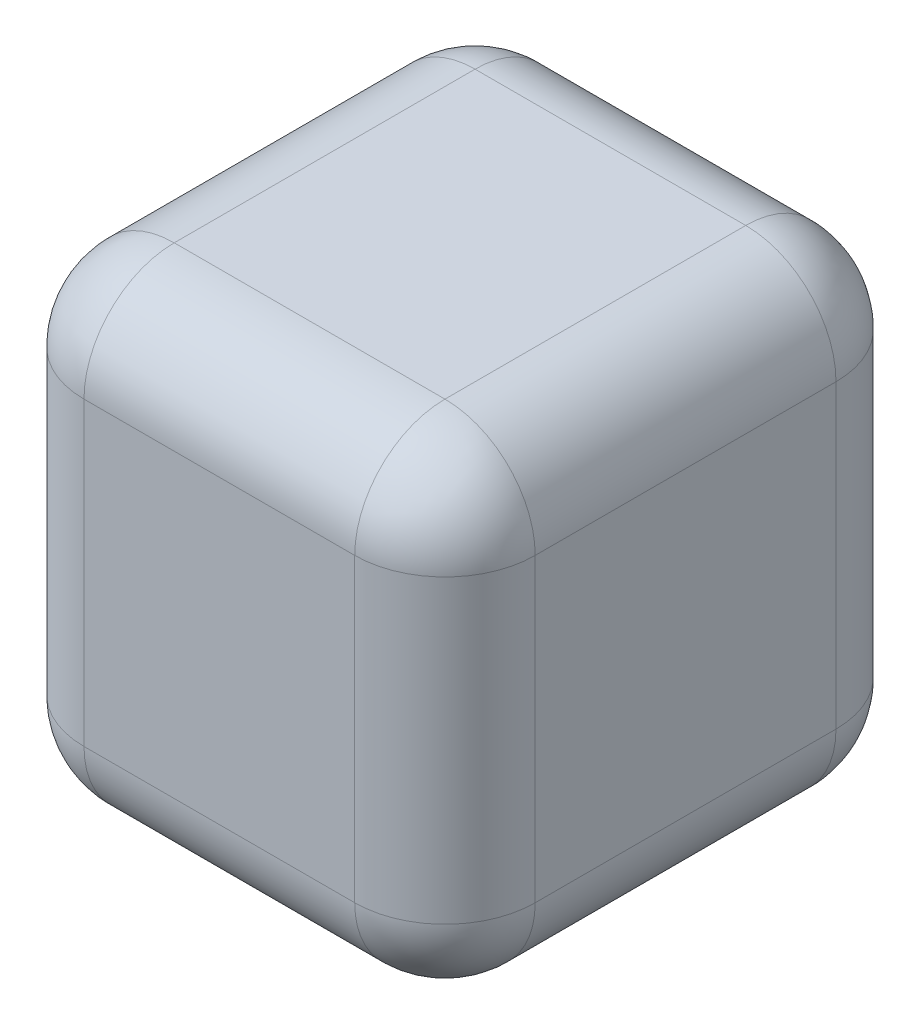
ISO-10303-21;
HEADER;
FILE_DESCRIPTION(('STEP AP214'),'2;1');
FILE_NAME('part.step','',(''),(''),'','','');
FILE_SCHEMA(('AUTOMOTIVE_DESIGN { 1 0 10303 214 1 1 1 1 }'));
ENDSEC;
DATA;
#1=APPLICATION_CONTEXT('core data for automotive mechanical design processes');
#2=APPLICATION_PROTOCOL_DEFINITION('international standard','automotive_design',2000,#1);
#3=PRODUCT_CONTEXT('',#1,'mechanical');
#4=PRODUCT('Part','Part','',(#3));
#5=PRODUCT_RELATED_PRODUCT_CATEGORY('part','',(#4));
#6=PRODUCT_DEFINITION_FORMATION('','',#4);
#7=PRODUCT_DEFINITION_CONTEXT('part definition',#1,'design');
#8=PRODUCT_DEFINITION('design','',#6,#7);
#9=PRODUCT_DEFINITION_SHAPE('','',#8);
#10=(LENGTH_UNIT() NAMED_UNIT(*) SI_UNIT(.MILLI.,.METRE.));
#11=(NAMED_UNIT(*) PLANE_ANGLE_UNIT() SI_UNIT($,.RADIAN.));
#12=(NAMED_UNIT(*) SI_UNIT($,.STERADIAN.) SOLID_ANGLE_UNIT());
#13=UNCERTAINTY_MEASURE_WITH_UNIT(LENGTH_MEASURE(1.E-05),#10,'distance_accuracy_value','');
#14=(GEOMETRIC_REPRESENTATION_CONTEXT(3) GLOBAL_UNCERTAINTY_ASSIGNED_CONTEXT((#13)) GLOBAL_UNIT_ASSIGNED_CONTEXT((#10,
#11,#12)) REPRESENTATION_CONTEXT('',''));
#15=CARTESIAN_POINT('',(0.,0.,0.));
#16=DIRECTION('',(0.,0.,1.));
#17=DIRECTION('',(1.,0.,0.));
#18=AXIS2_PLACEMENT_3D('',#15,#16,#17);
#19=CARTESIAN_POINT('',(54.,-16.,16.));
#20=DIRECTION('',(0.,0.,-1.));
#21=DIRECTION('',(-1.,0.,0.));
#22=AXIS2_PLACEMENT_3D('',#19,#20,#21);
#23=PLANE('',#22);
#24=DIRECTION('',(0.,-1.,0.));
#25=VECTOR('',#24,1.);
#26=CARTESIAN_POINT('',(48.,-16.,16.));
#27=LINE('',#26,#25);
#28=CARTESIAN_POINT('',(48.,-10.,16.));
#29=VERTEX_POINT('',#28);
#30=CARTESIAN_POINT('',(48.,10.,16.));
#31=VERTEX_POINT('',#30);
#32=EDGE_CURVE('E158',#29,#31,#27,.F.);
#33=ORIENTED_EDGE('',*,*,#32,.T.);
#34=DIRECTION('',(-1.,0.,0.));
#35=VECTOR('',#34,1.);
#36=CARTESIAN_POINT('',(54.,10.,16.));
#37=LINE('',#36,#35);
#38=CARTESIAN_POINT('',(30.,10.,16.));
#39=VERTEX_POINT('',#38);
#40=EDGE_CURVE('E161',#31,#39,#37,.T.);
#41=ORIENTED_EDGE('',*,*,#40,.T.);
#42=DIRECTION('',(0.,-1.,0.));
#43=VECTOR('',#42,1.);
#44=CARTESIAN_POINT('',(30.,-16.,16.));
#45=LINE('',#44,#43);
#46=CARTESIAN_POINT('',(30.,-10.,16.));
#47=VERTEX_POINT('',#46);
#48=EDGE_CURVE('E134',#39,#47,#45,.T.);
#49=ORIENTED_EDGE('',*,*,#48,.T.);
#50=DIRECTION('',(-1.,0.,0.));
#51=VECTOR('',#50,1.);
#52=CARTESIAN_POINT('',(54.,-10.,16.));
#53=LINE('',#52,#51);
#54=EDGE_CURVE('E153',#47,#29,#53,.F.);
#55=ORIENTED_EDGE('',*,*,#54,.T.);
#56=EDGE_LOOP('',(#33,#41,#49,#55));
#57=FACE_BOUND('',#56,.T.);
#58=ADVANCED_FACE('F37',(#57),#23,.F.);
#59=CARTESIAN_POINT('',(54.,-16.,16.));
#60=DIRECTION('',(0.,1.,0.));
#61=DIRECTION('',(0.,0.,1.));
#62=AXIS2_PLACEMENT_3D('',#59,#60,#61);
#63=PLANE('',#62);
#64=DIRECTION('',(0.,0.,-1.));
#65=VECTOR('',#64,1.);
#66=CARTESIAN_POINT('',(30.,-16.,-16.));
#67=LINE('',#66,#65);
#68=CARTESIAN_POINT('',(30.,-16.,10.));
#69=VERTEX_POINT('',#68);
#70=CARTESIAN_POINT('',(30.,-16.,-10.));
#71=VERTEX_POINT('',#70);
#72=EDGE_CURVE('E178',#69,#71,#67,.T.);
#73=ORIENTED_EDGE('',*,*,#72,.T.);
#74=DIRECTION('',(-1.,0.,0.));
#75=VECTOR('',#74,1.);
#76=CARTESIAN_POINT('',(54.,-16.,-10.));
#77=LINE('',#76,#75);
#78=CARTESIAN_POINT('',(48.,-16.,-10.));
#79=VERTEX_POINT('',#78);
#80=EDGE_CURVE('E181',#71,#79,#77,.F.);
#81=ORIENTED_EDGE('',*,*,#80,.T.);
#82=DIRECTION('',(0.,0.,-1.));
#83=VECTOR('',#82,1.);
#84=CARTESIAN_POINT('',(48.,-16.,16.));
#85=LINE('',#84,#83);
#86=CARTESIAN_POINT('',(48.,-16.,10.));
#87=VERTEX_POINT('',#86);
#88=EDGE_CURVE('E176',#79,#87,#85,.F.);
#89=ORIENTED_EDGE('',*,*,#88,.T.);
#90=DIRECTION('',(-1.,0.,0.));
#91=VECTOR('',#90,1.);
#92=CARTESIAN_POINT('',(54.,-16.,10.));
#93=LINE('',#92,#91);
#94=EDGE_CURVE('E174',#87,#69,#93,.T.);
#95=ORIENTED_EDGE('',*,*,#94,.T.);
#96=EDGE_LOOP('',(#73,#81,#89,#95));
#97=FACE_BOUND('',#96,.T.);
#98=ADVANCED_FACE('F328',(#97),#63,.F.);
#99=CARTESIAN_POINT('',(54.,-16.,-16.));
#100=DIRECTION('',(0.,0.,1.));
#101=DIRECTION('',(1.,0.,0.));
#102=AXIS2_PLACEMENT_3D('',#99,#100,#101);
#103=PLANE('',#102);
#104=DIRECTION('',(0.,1.,0.));
#105=VECTOR('',#104,1.);
#106=CARTESIAN_POINT('',(30.,16.,-16.));
#107=LINE('',#106,#105);
#108=CARTESIAN_POINT('',(30.,-10.,-16.));
#109=VERTEX_POINT('',#108);
#110=CARTESIAN_POINT('',(30.,10.,-16.));
#111=VERTEX_POINT('',#110);
#112=EDGE_CURVE('E187',#109,#111,#107,.T.);
#113=ORIENTED_EDGE('',*,*,#112,.T.);
#114=DIRECTION('',(-1.,0.,0.));
#115=VECTOR('',#114,1.);
#116=CARTESIAN_POINT('',(54.,10.,-16.));
#117=LINE('',#116,#115);
#118=CARTESIAN_POINT('',(48.,10.,-16.));
#119=VERTEX_POINT('',#118);
#120=EDGE_CURVE('E190',#111,#119,#117,.F.);
#121=ORIENTED_EDGE('',*,*,#120,.T.);
#122=DIRECTION('',(0.,1.,0.));
#123=VECTOR('',#122,1.);
#124=CARTESIAN_POINT('',(48.,-16.,-16.));
#125=LINE('',#124,#123);
#126=CARTESIAN_POINT('',(48.,-10.,-16.));
#127=VERTEX_POINT('',#126);
#128=EDGE_CURVE('E185',#119,#127,#125,.F.);
#129=ORIENTED_EDGE('',*,*,#128,.T.);
#130=DIRECTION('',(-1.,0.,0.));
#131=VECTOR('',#130,1.);
#132=CARTESIAN_POINT('',(54.,-10.,-16.));
#133=LINE('',#132,#131);
#134=EDGE_CURVE('E183',#127,#109,#133,.T.);
#135=ORIENTED_EDGE('',*,*,#134,.T.);
#136=EDGE_LOOP('',(#113,#121,#129,#135));
#137=FACE_BOUND('',#136,.T.);
#138=ADVANCED_FACE('F298',(#137),#103,.F.);
#139=CARTESIAN_POINT('',(54.,16.,16.));
#140=DIRECTION('',(0.,-1.,0.));
#141=DIRECTION('',(0.,0.,-1.));
#142=AXIS2_PLACEMENT_3D('',#139,#140,#141);
#143=PLANE('',#142);
#144=DIRECTION('',(0.,0.,1.));
#145=VECTOR('',#144,1.);
#146=CARTESIAN_POINT('',(30.,16.,16.));
#147=LINE('',#146,#145);
#148=CARTESIAN_POINT('',(30.,16.,-10.));
#149=VERTEX_POINT('',#148);
#150=CARTESIAN_POINT('',(30.,16.,10.));
#151=VERTEX_POINT('',#150);
#152=EDGE_CURVE('E196',#149,#151,#147,.T.);
#153=ORIENTED_EDGE('',*,*,#152,.T.);
#154=DIRECTION('',(-1.,0.,0.));
#155=VECTOR('',#154,1.);
#156=CARTESIAN_POINT('',(54.,16.,10.));
#157=LINE('',#156,#155);
#158=CARTESIAN_POINT('',(48.,16.,10.));
#159=VERTEX_POINT('',#158);
#160=EDGE_CURVE('E199',#151,#159,#157,.F.);
#161=ORIENTED_EDGE('',*,*,#160,.T.);
#162=DIRECTION('',(0.,0.,1.));
#163=VECTOR('',#162,1.);
#164=CARTESIAN_POINT('',(48.,16.,16.));
#165=LINE('',#164,#163);
#166=CARTESIAN_POINT('',(48.,16.,-10.));
#167=VERTEX_POINT('',#166);
#168=EDGE_CURVE('E194',#159,#167,#165,.F.);
#169=ORIENTED_EDGE('',*,*,#168,.T.);
#170=DIRECTION('',(-1.,0.,0.));
#171=VECTOR('',#170,1.);
#172=CARTESIAN_POINT('',(54.,16.,-10.));
#173=LINE('',#172,#171);
#174=EDGE_CURVE('E192',#167,#149,#173,.T.);
#175=ORIENTED_EDGE('',*,*,#174,.T.);
#176=EDGE_LOOP('',(#153,#161,#169,#175));
#177=FACE_BOUND('',#176,.T.);
#178=ADVANCED_FACE('F274',(#177),#143,.F.);
#179=CARTESIAN_POINT('',(54.,0.,0.));
#180=DIRECTION('',(-1.,0.,0.));
#181=DIRECTION('',(0.,0.,1.));
#182=AXIS2_PLACEMENT_3D('',#179,#180,#181);
#183=PLANE('',#182);
#184=DIRECTION('',(0.,0.,1.));
#185=VECTOR('',#184,1.);
#186=CARTESIAN_POINT('',(54.,10.,0.));
#187=LINE('',#186,#185);
#188=CARTESIAN_POINT('',(54.,10.,-10.));
#189=VERTEX_POINT('',#188);
#190=CARTESIAN_POINT('',(54.,10.,10.));
#191=VERTEX_POINT('',#190);
#192=EDGE_CURVE('E201',#189,#191,#187,.T.);
#193=ORIENTED_EDGE('',*,*,#192,.T.);
#194=DIRECTION('',(0.,-1.,0.));
#195=VECTOR('',#194,1.);
#196=CARTESIAN_POINT('',(54.,0.,10.));
#197=LINE('',#196,#195);
#198=CARTESIAN_POINT('',(54.,-10.,10.));
#199=VERTEX_POINT('',#198);
#200=EDGE_CURVE('E11',#191,#199,#197,.T.);
#201=ORIENTED_EDGE('',*,*,#200,.T.);
#202=DIRECTION('',(0.,0.,-1.));
#203=VECTOR('',#202,1.);
#204=CARTESIAN_POINT('',(54.,-10.,0.));
#205=LINE('',#204,#203);
#206=CARTESIAN_POINT('',(54.,-10.,-10.));
#207=VERTEX_POINT('',#206);
#208=EDGE_CURVE('E46',#199,#207,#205,.T.);
#209=ORIENTED_EDGE('',*,*,#208,.T.);
#210=DIRECTION('',(0.,1.,0.));
#211=VECTOR('',#210,1.);
#212=CARTESIAN_POINT('',(54.,0.,-10.));
#213=LINE('',#212,#211);
#214=EDGE_CURVE('E203',#207,#189,#213,.T.);
#215=ORIENTED_EDGE('',*,*,#214,.T.);
#216=EDGE_LOOP('',(#193,#201,#209,#215));
#217=FACE_BOUND('',#216,.T.);
#218=ADVANCED_FACE('F282',(#217),#183,.F.);
#219=CARTESIAN_POINT('',(24.,0.,0.));
#220=DIRECTION('',(-1.,0.,0.));
#221=DIRECTION('',(0.,0.,1.));
#222=AXIS2_PLACEMENT_3D('',#219,#220,#221);
#223=PLANE('',#222);
#224=CARTESIAN_POINT('',(24.,4.,-4.));
#225=DIRECTION('',(1.,0.,0.));
#226=DIRECTION('',(0.,0.,-1.));
#227=AXIS2_PLACEMENT_3D('',#224,#225,#226);
#228=CIRCLE('',#227,1.5);
#229=CARTESIAN_POINT('',(24.,4.,-5.5));
#230=VERTEX_POINT('',#229);
#231=EDGE_CURVE('E610',#230,#230,#228,.T.);
#232=ORIENTED_EDGE('',*,*,#231,.T.);
#233=EDGE_LOOP('',(#232));
#234=FACE_BOUND('',#233,.T.);
#235=CARTESIAN_POINT('',(24.,4.,4.));
#236=DIRECTION('',(1.,0.,0.));
#237=DIRECTION('',(0.,0.,-1.));
#238=AXIS2_PLACEMENT_3D('',#235,#236,#237);
#239=CIRCLE('',#238,1.5);
#240=CARTESIAN_POINT('',(24.,4.,2.5));
#241=VERTEX_POINT('',#240);
#242=EDGE_CURVE('E615',#241,#241,#239,.T.);
#243=ORIENTED_EDGE('',*,*,#242,.T.);
#244=EDGE_LOOP('',(#243));
#245=FACE_BOUND('',#244,.T.);
#246=CARTESIAN_POINT('',(24.,-4.,-4.));
#247=DIRECTION('',(1.,0.,0.));
#248=DIRECTION('',(0.,0.,-1.));
#249=AXIS2_PLACEMENT_3D('',#246,#247,#248);
#250=CIRCLE('',#249,1.5);
#251=CARTESIAN_POINT('',(24.,-4.,-5.5));
#252=VERTEX_POINT('',#251);
#253=EDGE_CURVE('E621',#252,#252,#250,.T.);
#254=ORIENTED_EDGE('',*,*,#253,.T.);
#255=EDGE_LOOP('',(#254));
#256=FACE_BOUND('',#255,.T.);
#257=CARTESIAN_POINT('',(24.,-4.,4.));
#258=DIRECTION('',(1.,0.,0.));
#259=DIRECTION('',(0.,0.,-1.));
#260=AXIS2_PLACEMENT_3D('',#257,#258,#259);
#261=CIRCLE('',#260,1.5);
#262=CARTESIAN_POINT('',(24.,-4.,2.5));
#263=VERTEX_POINT('',#262);
#264=EDGE_CURVE('E140',#263,#263,#261,.T.);
#265=ORIENTED_EDGE('',*,*,#264,.T.);
#266=EDGE_LOOP('',(#265));
#267=FACE_BOUND('',#266,.T.);
#268=DIRECTION('',(0.,0.,-1.));
#269=VECTOR('',#268,1.);
#270=CARTESIAN_POINT('',(24.,-10.,16.));
#271=LINE('',#270,#269);
#272=CARTESIAN_POINT('',(24.,-10.,-10.));
#273=VERTEX_POINT('',#272);
#274=CARTESIAN_POINT('',(24.,-10.,10.));
#275=VERTEX_POINT('',#274);
#276=EDGE_CURVE('E171',#273,#275,#271,.F.);
#277=ORIENTED_EDGE('',*,*,#276,.T.);
#278=DIRECTION('',(0.,-1.,0.));
#279=VECTOR('',#278,1.);
#280=CARTESIAN_POINT('',(24.,16.,10.));
#281=LINE('',#280,#279);
#282=CARTESIAN_POINT('',(24.,10.,10.));
#283=VERTEX_POINT('',#282);
#284=EDGE_CURVE('E136',#275,#283,#281,.F.);
#285=ORIENTED_EDGE('',*,*,#284,.T.);
#286=DIRECTION('',(0.,0.,1.));
#287=VECTOR('',#286,1.);
#288=CARTESIAN_POINT('',(24.,10.,-16.));
#289=LINE('',#288,#287);
#290=CARTESIAN_POINT('',(24.,10.,-10.));
#291=VERTEX_POINT('',#290);
#292=EDGE_CURVE('E164',#283,#291,#289,.F.);
#293=ORIENTED_EDGE('',*,*,#292,.T.);
#294=DIRECTION('',(0.,1.,0.));
#295=VECTOR('',#294,1.);
#296=CARTESIAN_POINT('',(24.,-16.,-10.));
#297=LINE('',#296,#295);
#298=EDGE_CURVE('E169',#291,#273,#297,.F.);
#299=ORIENTED_EDGE('',*,*,#298,.T.);
#300=EDGE_LOOP('',(#277,#285,#293,#299));
#301=FACE_BOUND('',#300,.T.);
#302=ADVANCED_FACE('F362',(#234,#245,#256,#267,#301),#223,.T.);
#303=CARTESIAN_POINT('',(48.,0.,-10.));
#304=DIRECTION('',(0.,1.,0.));
#305=DIRECTION('',(0.,0.,1.));
#306=AXIS2_PLACEMENT_3D('',#303,#304,#305);
#307=CYLINDRICAL_SURFACE('',#306,6.);
#308=CARTESIAN_POINT('',(48.,10.,-10.));
#309=DIRECTION('',(0.,1.,0.));
#310=DIRECTION('',(0.,0.,1.));
#311=AXIS2_PLACEMENT_3D('',#308,#309,#310);
#312=CIRCLE('',#311,6.);
#313=EDGE_CURVE('E41',#189,#119,#312,.T.);
#314=ORIENTED_EDGE('',*,*,#313,.F.);
#315=ORIENTED_EDGE('',*,*,#214,.F.);
#316=CARTESIAN_POINT('',(48.,-10.,-10.));
#317=DIRECTION('',(0.,-1.,0.));
#318=DIRECTION('',(0.,0.,-1.));
#319=AXIS2_PLACEMENT_3D('',#316,#317,#318);
#320=CIRCLE('',#319,6.);
#321=EDGE_CURVE('E252',#127,#207,#320,.T.);
#322=ORIENTED_EDGE('',*,*,#321,.F.);
#323=ORIENTED_EDGE('',*,*,#128,.F.);
#324=EDGE_LOOP('',(#314,#315,#322,#323));
#325=FACE_BOUND('',#324,.T.);
#326=ADVANCED_FACE('F39',(#325),#307,.T.);
#327=CARTESIAN_POINT('',(48.,10.,-10.));
#328=DIRECTION('',(0.,0.,-1.));
#329=DIRECTION('',(-1.,0.,0.));
#330=AXIS2_PLACEMENT_3D('',#327,#328,#329);
#331=SPHERICAL_SURFACE('',#330,6.);
#332=CARTESIAN_POINT('',(48.,10.,-10.));
#333=DIRECTION('',(0.,0.,-1.));
#334=DIRECTION('',(-1.,0.,0.));
#335=AXIS2_PLACEMENT_3D('',#332,#333,#334);
#336=CIRCLE('',#335,6.);
#337=EDGE_CURVE('E247',#189,#167,#336,.F.);
#338=ORIENTED_EDGE('',*,*,#337,.F.);
#339=ORIENTED_EDGE('',*,*,#313,.T.);
#340=CARTESIAN_POINT('',(48.,10.,-10.));
#341=DIRECTION('',(1.,0.,0.));
#342=DIRECTION('',(0.,0.,-1.));
#343=AXIS2_PLACEMENT_3D('',#340,#341,#342);
#344=CIRCLE('',#343,6.);
#345=EDGE_CURVE('E250',#167,#119,#344,.F.);
#346=ORIENTED_EDGE('',*,*,#345,.F.);
#347=EDGE_LOOP('',(#338,#339,#346));
#348=FACE_BOUND('',#347,.T.);
#349=ADVANCED_FACE('F263',(#348),#331,.T.);
#350=CARTESIAN_POINT('',(48.,-10.,-10.));
#351=DIRECTION('',(1.,0.,0.));
#352=DIRECTION('',(0.,0.,-1.));
#353=AXIS2_PLACEMENT_3D('',#350,#351,#352);
#354=SPHERICAL_SURFACE('',#353,6.);
#355=CARTESIAN_POINT('',(48.,-10.,-10.));
#356=DIRECTION('',(1.,0.,0.));
#357=DIRECTION('',(0.,0.,-1.));
#358=AXIS2_PLACEMENT_3D('',#355,#356,#357);
#359=CIRCLE('',#358,6.);
#360=EDGE_CURVE('E241',#127,#79,#359,.F.);
#361=ORIENTED_EDGE('',*,*,#360,.F.);
#362=ORIENTED_EDGE('',*,*,#321,.T.);
#363=CARTESIAN_POINT('',(48.,-10.,-10.));
#364=DIRECTION('',(0.,0.,-1.));
#365=DIRECTION('',(-1.,0.,0.));
#366=AXIS2_PLACEMENT_3D('',#363,#364,#365);
#367=CIRCLE('',#366,6.);
#368=EDGE_CURVE('E244',#79,#207,#367,.F.);
#369=ORIENTED_EDGE('',*,*,#368,.F.);
#370=EDGE_LOOP('',(#361,#362,#369));
#371=FACE_BOUND('',#370,.T.);
#372=ADVANCED_FACE('F290',(#371),#354,.T.);
#373=CARTESIAN_POINT('',(54.,10.,-10.));
#374=DIRECTION('',(-1.,0.,0.));
#375=DIRECTION('',(0.,0.,1.));
#376=AXIS2_PLACEMENT_3D('',#373,#374,#375);
#377=CYLINDRICAL_SURFACE('',#376,6.);
#378=ORIENTED_EDGE('',*,*,#345,.T.);
#379=ORIENTED_EDGE('',*,*,#120,.F.);
#380=CARTESIAN_POINT('',(30.,10.,-10.));
#381=DIRECTION('',(-1.,0.,0.));
#382=DIRECTION('',(0.,0.,1.));
#383=AXIS2_PLACEMENT_3D('',#380,#381,#382);
#384=CIRCLE('',#383,6.);
#385=EDGE_CURVE('E236',#149,#111,#384,.T.);
#386=ORIENTED_EDGE('',*,*,#385,.F.);
#387=ORIENTED_EDGE('',*,*,#174,.F.);
#388=EDGE_LOOP('',(#378,#379,#386,#387));
#389=FACE_BOUND('',#388,.T.);
#390=ADVANCED_FACE('F270',(#389),#377,.T.);
#391=CARTESIAN_POINT('',(48.,10.,0.));
#392=DIRECTION('',(0.,0.,1.));
#393=DIRECTION('',(1.,0.,0.));
#394=AXIS2_PLACEMENT_3D('',#391,#392,#393);
#395=CYLINDRICAL_SURFACE('',#394,6.);
#396=ORIENTED_EDGE('',*,*,#337,.T.);
#397=ORIENTED_EDGE('',*,*,#168,.F.);
#398=CARTESIAN_POINT('',(48.,10.,10.));
#399=DIRECTION('',(0.,0.,1.));
#400=DIRECTION('',(1.,0.,0.));
#401=AXIS2_PLACEMENT_3D('',#398,#399,#400);
#402=CIRCLE('',#401,6.);
#403=EDGE_CURVE('E233',#191,#159,#402,.T.);
#404=ORIENTED_EDGE('',*,*,#403,.F.);
#405=ORIENTED_EDGE('',*,*,#192,.F.);
#406=EDGE_LOOP('',(#396,#397,#404,#405));
#407=FACE_BOUND('',#406,.T.);
#408=ADVANCED_FACE('F280',(#407),#395,.T.);
#409=CARTESIAN_POINT('',(48.,0.,10.));
#410=DIRECTION('',(0.,-1.,0.));
#411=DIRECTION('',(0.,0.,-1.));
#412=AXIS2_PLACEMENT_3D('',#409,#410,#411);
#413=CYLINDRICAL_SURFACE('',#412,6.);
#414=CARTESIAN_POINT('',(48.,-10.,10.));
#415=DIRECTION('',(0.,-1.,0.));
#416=DIRECTION('',(0.,0.,-1.));
#417=AXIS2_PLACEMENT_3D('',#414,#415,#416);
#418=CIRCLE('',#417,6.);
#419=EDGE_CURVE('E228',#199,#29,#418,.T.);
#420=ORIENTED_EDGE('',*,*,#419,.F.);
#421=ORIENTED_EDGE('',*,*,#200,.F.);
#422=CARTESIAN_POINT('',(48.,10.,10.));
#423=DIRECTION('',(0.,1.,0.));
#424=DIRECTION('',(-1.,0.,0.));
#425=AXIS2_PLACEMENT_3D('',#422,#423,#424);
#426=CIRCLE('',#425,6.);
#427=EDGE_CURVE('E230',#31,#191,#426,.T.);
#428=ORIENTED_EDGE('',*,*,#427,.F.);
#429=ORIENTED_EDGE('',*,*,#32,.F.);
#430=EDGE_LOOP('',(#420,#421,#428,#429));
#431=FACE_BOUND('',#430,.T.);
#432=ADVANCED_FACE('F285',(#431),#413,.T.);
#433=CARTESIAN_POINT('',(48.,-10.,0.));
#434=DIRECTION('',(0.,0.,-1.));
#435=DIRECTION('',(-1.,0.,0.));
#436=AXIS2_PLACEMENT_3D('',#433,#434,#435);
#437=CYLINDRICAL_SURFACE('',#436,6.);
#438=ORIENTED_EDGE('',*,*,#368,.T.);
#439=ORIENTED_EDGE('',*,*,#208,.F.);
#440=CARTESIAN_POINT('',(48.,-10.,10.));
#441=DIRECTION('',(0.,0.,1.));
#442=DIRECTION('',(1.,0.,0.));
#443=AXIS2_PLACEMENT_3D('',#440,#441,#442);
#444=CIRCLE('',#443,6.);
#445=EDGE_CURVE('E54',#87,#199,#444,.T.);
#446=ORIENTED_EDGE('',*,*,#445,.F.);
#447=ORIENTED_EDGE('',*,*,#88,.F.);
#448=EDGE_LOOP('',(#438,#439,#446,#447));
#449=FACE_BOUND('',#448,.T.);
#450=ADVANCED_FACE('F288',(#449),#437,.T.);
#451=CARTESIAN_POINT('',(54.,-10.,-10.));
#452=DIRECTION('',(-1.,0.,0.));
#453=DIRECTION('',(0.,0.,1.));
#454=AXIS2_PLACEMENT_3D('',#451,#452,#453);
#455=CYLINDRICAL_SURFACE('',#454,6.);
#456=ORIENTED_EDGE('',*,*,#360,.T.);
#457=ORIENTED_EDGE('',*,*,#80,.F.);
#458=CARTESIAN_POINT('',(30.,-10.,-10.));
#459=DIRECTION('',(-1.,0.,0.));
#460=DIRECTION('',(0.,0.,1.));
#461=AXIS2_PLACEMENT_3D('',#458,#459,#460);
#462=CIRCLE('',#461,6.);
#463=EDGE_CURVE('E224',#109,#71,#462,.T.);
#464=ORIENTED_EDGE('',*,*,#463,.F.);
#465=ORIENTED_EDGE('',*,*,#134,.F.);
#466=EDGE_LOOP('',(#456,#457,#464,#465));
#467=FACE_BOUND('',#466,.T.);
#468=ADVANCED_FACE('F295',(#467),#455,.T.);
#469=CARTESIAN_POINT('',(30.,-16.,-10.));
#470=DIRECTION('',(0.,-1.,0.));
#471=DIRECTION('',(0.,0.,-1.));
#472=AXIS2_PLACEMENT_3D('',#469,#470,#471);
#473=CYLINDRICAL_SURFACE('',#472,6.);
#474=CARTESIAN_POINT('',(30.,10.,-10.));
#475=DIRECTION('',(0.,1.,0.));
#476=DIRECTION('',(0.,0.,1.));
#477=AXIS2_PLACEMENT_3D('',#474,#475,#476);
#478=CIRCLE('',#477,6.);
#479=EDGE_CURVE('E238',#111,#291,#478,.T.);
#480=ORIENTED_EDGE('',*,*,#479,.F.);
#481=ORIENTED_EDGE('',*,*,#112,.F.);
#482=CARTESIAN_POINT('',(30.,-10.,-10.));
#483=DIRECTION('',(0.,-1.,0.));
#484=DIRECTION('',(0.,0.,-1.));
#485=AXIS2_PLACEMENT_3D('',#482,#483,#484);
#486=CIRCLE('',#485,6.);
#487=EDGE_CURVE('E221',#273,#109,#486,.T.);
#488=ORIENTED_EDGE('',*,*,#487,.F.);
#489=ORIENTED_EDGE('',*,*,#298,.F.);
#490=EDGE_LOOP('',(#480,#481,#488,#489));
#491=FACE_BOUND('',#490,.T.);
#492=ADVANCED_FACE('F302',(#491),#473,.T.);
#493=CARTESIAN_POINT('',(30.,10.,-10.));
#494=DIRECTION('',(0.,0.,-1.));
#495=DIRECTION('',(-1.,0.,0.));
#496=AXIS2_PLACEMENT_3D('',#493,#494,#495);
#497=SPHERICAL_SURFACE('',#496,6.);
#498=ORIENTED_EDGE('',*,*,#385,.T.);
#499=ORIENTED_EDGE('',*,*,#479,.T.);
#500=CARTESIAN_POINT('',(30.,10.,-10.));
#501=DIRECTION('',(0.,0.,-1.));
#502=DIRECTION('',(0.,1.,0.));
#503=AXIS2_PLACEMENT_3D('',#500,#501,#502);
#504=CIRCLE('',#503,6.);
#505=EDGE_CURVE('E218',#149,#291,#504,.F.);
#506=ORIENTED_EDGE('',*,*,#505,.F.);
#507=EDGE_LOOP('',(#498,#499,#506));
#508=FACE_BOUND('',#507,.T.);
#509=ADVANCED_FACE('F306',(#508),#497,.T.);
#510=CARTESIAN_POINT('',(48.,10.,10.));
#511=DIRECTION('',(1.,0.,0.));
#512=DIRECTION('',(0.,0.,-1.));
#513=AXIS2_PLACEMENT_3D('',#510,#511,#512);
#514=SPHERICAL_SURFACE('',#513,6.);
#515=ORIENTED_EDGE('',*,*,#427,.T.);
#516=ORIENTED_EDGE('',*,*,#403,.T.);
#517=CARTESIAN_POINT('',(48.,10.,10.));
#518=DIRECTION('',(1.,0.,0.));
#519=DIRECTION('',(0.,0.,-1.));
#520=AXIS2_PLACEMENT_3D('',#517,#518,#519);
#521=CIRCLE('',#520,6.);
#522=EDGE_CURVE('E215',#31,#159,#521,.F.);
#523=ORIENTED_EDGE('',*,*,#522,.F.);
#524=EDGE_LOOP('',(#515,#516,#523));
#525=FACE_BOUND('',#524,.T.);
#526=ADVANCED_FACE('F316',(#525),#514,.T.);
#527=CARTESIAN_POINT('',(48.,-10.,10.));
#528=DIRECTION('',(1.,0.,0.));
#529=DIRECTION('',(0.,0.,-1.));
#530=AXIS2_PLACEMENT_3D('',#527,#528,#529);
#531=SPHERICAL_SURFACE('',#530,6.);
#532=ORIENTED_EDGE('',*,*,#445,.T.);
#533=ORIENTED_EDGE('',*,*,#419,.T.);
#534=CARTESIAN_POINT('',(48.,-10.,10.));
#535=DIRECTION('',(1.,0.,0.));
#536=DIRECTION('',(0.,0.,-1.));
#537=AXIS2_PLACEMENT_3D('',#534,#535,#536);
#538=CIRCLE('',#537,6.);
#539=EDGE_CURVE('E155',#87,#29,#538,.F.);
#540=ORIENTED_EDGE('',*,*,#539,.F.);
#541=EDGE_LOOP('',(#532,#533,#540));
#542=FACE_BOUND('',#541,.T.);
#543=ADVANCED_FACE('F318',(#542),#531,.T.);
#544=CARTESIAN_POINT('',(30.,-10.,-10.));
#545=DIRECTION('',(0.,0.,-1.));
#546=DIRECTION('',(-1.,0.,0.));
#547=AXIS2_PLACEMENT_3D('',#544,#545,#546);
#548=SPHERICAL_SURFACE('',#547,6.);
#549=ORIENTED_EDGE('',*,*,#487,.T.);
#550=ORIENTED_EDGE('',*,*,#463,.T.);
#551=CARTESIAN_POINT('',(30.,-10.,-10.));
#552=DIRECTION('',(0.,0.,-1.));
#553=DIRECTION('',(-1.,0.,0.));
#554=AXIS2_PLACEMENT_3D('',#551,#552,#553);
#555=CIRCLE('',#554,6.);
#556=EDGE_CURVE('E212',#273,#71,#555,.F.);
#557=ORIENTED_EDGE('',*,*,#556,.F.);
#558=EDGE_LOOP('',(#549,#550,#557));
#559=FACE_BOUND('',#558,.T.);
#560=ADVANCED_FACE('F324',(#559),#548,.T.);
#561=CARTESIAN_POINT('',(30.,10.,16.));
#562=DIRECTION('',(0.,0.,-1.));
#563=DIRECTION('',(-1.,0.,0.));
#564=AXIS2_PLACEMENT_3D('',#561,#562,#563);
#565=CYLINDRICAL_SURFACE('',#564,6.);
#566=ORIENTED_EDGE('',*,*,#505,.T.);
#567=ORIENTED_EDGE('',*,*,#292,.F.);
#568=CARTESIAN_POINT('',(30.,10.,10.));
#569=DIRECTION('',(0.,0.,1.));
#570=DIRECTION('',(1.,0.,0.));
#571=AXIS2_PLACEMENT_3D('',#568,#569,#570);
#572=CIRCLE('',#571,6.);
#573=EDGE_CURVE('E209',#151,#283,#572,.T.);
#574=ORIENTED_EDGE('',*,*,#573,.F.);
#575=ORIENTED_EDGE('',*,*,#152,.F.);
#576=EDGE_LOOP('',(#566,#567,#574,#575));
#577=FACE_BOUND('',#576,.T.);
#578=ADVANCED_FACE('F309',(#577),#565,.T.);
#579=CARTESIAN_POINT('',(54.,10.,10.));
#580=DIRECTION('',(-1.,0.,0.));
#581=DIRECTION('',(0.,0.,1.));
#582=AXIS2_PLACEMENT_3D('',#579,#580,#581);
#583=CYLINDRICAL_SURFACE('',#582,6.);
#584=ORIENTED_EDGE('',*,*,#522,.T.);
#585=ORIENTED_EDGE('',*,*,#160,.F.);
#586=CARTESIAN_POINT('',(30.,10.,10.));
#587=DIRECTION('',(-1.,0.,0.));
#588=DIRECTION('',(0.,0.,1.));
#589=AXIS2_PLACEMENT_3D('',#586,#587,#588);
#590=CIRCLE('',#589,6.);
#591=EDGE_CURVE('E150',#39,#151,#590,.T.);
#592=ORIENTED_EDGE('',*,*,#591,.F.);
#593=ORIENTED_EDGE('',*,*,#40,.F.);
#594=EDGE_LOOP('',(#584,#585,#592,#593));
#595=FACE_BOUND('',#594,.T.);
#596=ADVANCED_FACE('F314',(#595),#583,.T.);
#597=CARTESIAN_POINT('',(54.,-10.,10.));
#598=DIRECTION('',(-1.,0.,0.));
#599=DIRECTION('',(0.,0.,1.));
#600=AXIS2_PLACEMENT_3D('',#597,#598,#599);
#601=CYLINDRICAL_SURFACE('',#600,6.);
#602=ORIENTED_EDGE('',*,*,#539,.T.);
#603=ORIENTED_EDGE('',*,*,#54,.F.);
#604=CARTESIAN_POINT('',(30.,-10.,10.));
#605=DIRECTION('',(-1.,0.,0.));
#606=DIRECTION('',(0.,0.,1.));
#607=AXIS2_PLACEMENT_3D('',#604,#605,#606);
#608=CIRCLE('',#607,6.);
#609=EDGE_CURVE('E143',#69,#47,#608,.T.);
#610=ORIENTED_EDGE('',*,*,#609,.F.);
#611=ORIENTED_EDGE('',*,*,#94,.F.);
#612=EDGE_LOOP('',(#602,#603,#610,#611));
#613=FACE_BOUND('',#612,.T.);
#614=ADVANCED_FACE('F154',(#613),#601,.T.);
#615=CARTESIAN_POINT('',(30.,-10.,16.));
#616=DIRECTION('',(0.,0.,1.));
#617=DIRECTION('',(1.,0.,0.));
#618=AXIS2_PLACEMENT_3D('',#615,#616,#617);
#619=CYLINDRICAL_SURFACE('',#618,6.);
#620=ORIENTED_EDGE('',*,*,#556,.T.);
#621=ORIENTED_EDGE('',*,*,#72,.F.);
#622=CARTESIAN_POINT('',(30.,-10.,10.));
#623=DIRECTION('',(0.,0.,1.));
#624=DIRECTION('',(1.,0.,0.));
#625=AXIS2_PLACEMENT_3D('',#622,#623,#624);
#626=CIRCLE('',#625,6.);
#627=EDGE_CURVE('E147',#275,#69,#626,.T.);
#628=ORIENTED_EDGE('',*,*,#627,.F.);
#629=ORIENTED_EDGE('',*,*,#276,.F.);
#630=EDGE_LOOP('',(#620,#621,#628,#629));
#631=FACE_BOUND('',#630,.T.);
#632=ADVANCED_FACE('F345',(#631),#619,.T.);
#633=CARTESIAN_POINT('',(30.,10.,10.));
#634=DIRECTION('',(0.,1.,0.));
#635=DIRECTION('',(0.,0.,1.));
#636=AXIS2_PLACEMENT_3D('',#633,#634,#635);
#637=SPHERICAL_SURFACE('',#636,6.);
#638=ORIENTED_EDGE('',*,*,#591,.T.);
#639=ORIENTED_EDGE('',*,*,#573,.T.);
#640=CARTESIAN_POINT('',(30.,10.,10.));
#641=DIRECTION('',(0.,1.,0.));
#642=DIRECTION('',(0.,0.,1.));
#643=AXIS2_PLACEMENT_3D('',#640,#641,#642);
#644=CIRCLE('',#643,6.);
#645=EDGE_CURVE('E139',#39,#283,#644,.F.);
#646=ORIENTED_EDGE('',*,*,#645,.F.);
#647=EDGE_LOOP('',(#638,#639,#646));
#648=FACE_BOUND('',#647,.T.);
#649=ADVANCED_FACE('F342',(#648),#637,.T.);
#650=CARTESIAN_POINT('',(30.,-10.,10.));
#651=DIRECTION('',(0.,-1.,0.));
#652=DIRECTION('',(0.,0.,-1.));
#653=AXIS2_PLACEMENT_3D('',#650,#651,#652);
#654=SPHERICAL_SURFACE('',#653,6.);
#655=ORIENTED_EDGE('',*,*,#627,.T.);
#656=ORIENTED_EDGE('',*,*,#609,.T.);
#657=CARTESIAN_POINT('',(30.,-10.,10.));
#658=DIRECTION('',(0.,-1.,0.));
#659=DIRECTION('',(0.,0.,-1.));
#660=AXIS2_PLACEMENT_3D('',#657,#658,#659);
#661=CIRCLE('',#660,6.);
#662=EDGE_CURVE('E130',#275,#47,#661,.F.);
#663=ORIENTED_EDGE('',*,*,#662,.F.);
#664=EDGE_LOOP('',(#655,#656,#663));
#665=FACE_BOUND('',#664,.T.);
#666=ADVANCED_FACE('F145',(#665),#654,.T.);
#667=CARTESIAN_POINT('',(30.,-16.,10.));
#668=DIRECTION('',(0.,1.,0.));
#669=DIRECTION('',(0.,0.,1.));
#670=AXIS2_PLACEMENT_3D('',#667,#668,#669);
#671=CYLINDRICAL_SURFACE('',#670,6.);
#672=ORIENTED_EDGE('',*,*,#645,.T.);
#673=ORIENTED_EDGE('',*,*,#284,.F.);
#674=ORIENTED_EDGE('',*,*,#662,.T.);
#675=ORIENTED_EDGE('',*,*,#48,.F.);
#676=EDGE_LOOP('',(#672,#673,#674,#675));
#677=FACE_BOUND('',#676,.T.);
#678=ADVANCED_FACE('F132',(#677),#671,.T.);
#679=CARTESIAN_POINT('',(24.,-4.,4.));
#680=DIRECTION('',(-1.,0.,0.));
#681=DIRECTION('',(0.,0.,1.));
#682=AXIS2_PLACEMENT_3D('',#679,#680,#681);
#683=CYLINDRICAL_SURFACE('',#682,1.5);
#684=ORIENTED_EDGE('',*,*,#264,.F.);
#685=EDGE_LOOP('',(#684));
#686=FACE_BOUND('',#685,.T.);
#687=CARTESIAN_POINT('',(21.2,-4.,4.));
#688=DIRECTION('',(1.,0.,0.));
#689=DIRECTION('',(0.,0.,-1.));
#690=AXIS2_PLACEMENT_3D('',#687,#688,#689);
#691=CIRCLE('',#690,1.5);
#692=CARTESIAN_POINT('',(21.2,-4.,2.5));
#693=VERTEX_POINT('',#692);
#694=EDGE_CURVE('E624',#693,#693,#691,.T.);
#695=ORIENTED_EDGE('',*,*,#694,.T.);
#696=EDGE_LOOP('',(#695));
#697=FACE_BOUND('',#696,.T.);
#698=ADVANCED_FACE('F339',(#686,#697),#683,.T.);
#699=CARTESIAN_POINT('',(21.2,-4.,4.));
#700=DIRECTION('',(1.,0.,0.));
#701=DIRECTION('',(0.,0.,-1.));
#702=AXIS2_PLACEMENT_3D('',#699,#700,#701);
#703=PLANE('',#702);
#704=ORIENTED_EDGE('',*,*,#694,.F.);
#705=EDGE_LOOP('',(#704));
#706=FACE_BOUND('',#705,.T.);
#707=ADVANCED_FACE('F533',(#706),#703,.F.);
#708=CARTESIAN_POINT('',(24.,-4.,-4.));
#709=DIRECTION('',(-1.,0.,0.));
#710=DIRECTION('',(0.,0.,1.));
#711=AXIS2_PLACEMENT_3D('',#708,#709,#710);
#712=CYLINDRICAL_SURFACE('',#711,1.5);
#713=ORIENTED_EDGE('',*,*,#253,.F.);
#714=EDGE_LOOP('',(#713));
#715=FACE_BOUND('',#714,.T.);
#716=CARTESIAN_POINT('',(21.2,-4.,-4.));
#717=DIRECTION('',(1.,0.,0.));
#718=DIRECTION('',(0.,0.,-1.));
#719=AXIS2_PLACEMENT_3D('',#716,#717,#718);
#720=CIRCLE('',#719,1.5);
#721=CARTESIAN_POINT('',(21.2,-4.,-5.5));
#722=VERTEX_POINT('',#721);
#723=EDGE_CURVE('E618',#722,#722,#720,.T.);
#724=ORIENTED_EDGE('',*,*,#723,.T.);
#725=EDGE_LOOP('',(#724));
#726=FACE_BOUND('',#725,.T.);
#727=ADVANCED_FACE('F542',(#715,#726),#712,.T.);
#728=CARTESIAN_POINT('',(21.2,-4.,-4.));
#729=DIRECTION('',(1.,0.,0.));
#730=DIRECTION('',(0.,0.,-1.));
#731=AXIS2_PLACEMENT_3D('',#728,#729,#730);
#732=PLANE('',#731);
#733=ORIENTED_EDGE('',*,*,#723,.F.);
#734=EDGE_LOOP('',(#733));
#735=FACE_BOUND('',#734,.T.);
#736=ADVANCED_FACE('F552',(#735),#732,.F.);
#737=CARTESIAN_POINT('',(24.,4.,4.));
#738=DIRECTION('',(-1.,0.,0.));
#739=DIRECTION('',(0.,0.,1.));
#740=AXIS2_PLACEMENT_3D('',#737,#738,#739);
#741=CYLINDRICAL_SURFACE('',#740,1.5);
#742=ORIENTED_EDGE('',*,*,#242,.F.);
#743=EDGE_LOOP('',(#742));
#744=FACE_BOUND('',#743,.T.);
#745=CARTESIAN_POINT('',(21.2,4.,4.));
#746=DIRECTION('',(1.,0.,0.));
#747=DIRECTION('',(0.,0.,-1.));
#748=AXIS2_PLACEMENT_3D('',#745,#746,#747);
#749=CIRCLE('',#748,1.5);
#750=CARTESIAN_POINT('',(21.2,4.,2.5));
#751=VERTEX_POINT('',#750);
#752=EDGE_CURVE('E612',#751,#751,#749,.T.);
#753=ORIENTED_EDGE('',*,*,#752,.T.);
#754=EDGE_LOOP('',(#753));
#755=FACE_BOUND('',#754,.T.);
#756=ADVANCED_FACE('F562',(#744,#755),#741,.T.);
#757=CARTESIAN_POINT('',(21.2,4.,4.));
#758=DIRECTION('',(1.,0.,0.));
#759=DIRECTION('',(0.,0.,-1.));
#760=AXIS2_PLACEMENT_3D('',#757,#758,#759);
#761=PLANE('',#760);
#762=ORIENTED_EDGE('',*,*,#752,.F.);
#763=EDGE_LOOP('',(#762));
#764=FACE_BOUND('',#763,.T.);
#765=ADVANCED_FACE('F572',(#764),#761,.F.);
#766=CARTESIAN_POINT('',(24.,4.,-4.));
#767=DIRECTION('',(-1.,0.,0.));
#768=DIRECTION('',(0.,0.,1.));
#769=AXIS2_PLACEMENT_3D('',#766,#767,#768);
#770=CYLINDRICAL_SURFACE('',#769,1.5);
#771=ORIENTED_EDGE('',*,*,#231,.F.);
#772=EDGE_LOOP('',(#771));
#773=FACE_BOUND('',#772,.T.);
#774=CARTESIAN_POINT('',(21.2,4.,-4.));
#775=DIRECTION('',(1.,0.,0.));
#776=DIRECTION('',(0.,0.,-1.));
#777=AXIS2_PLACEMENT_3D('',#774,#775,#776);
#778=CIRCLE('',#777,1.5);
#779=CARTESIAN_POINT('',(21.2,4.,-5.5));
#780=VERTEX_POINT('',#779);
#781=EDGE_CURVE('E608',#780,#780,#778,.T.);
#782=ORIENTED_EDGE('',*,*,#781,.T.);
#783=EDGE_LOOP('',(#782));
#784=FACE_BOUND('',#783,.T.);
#785=ADVANCED_FACE('F582',(#773,#784),#770,.T.);
#786=CARTESIAN_POINT('',(21.2,4.,-4.));
#787=DIRECTION('',(1.,0.,0.));
#788=DIRECTION('',(0.,0.,-1.));
#789=AXIS2_PLACEMENT_3D('',#786,#787,#788);
#790=PLANE('',#789);
#791=ORIENTED_EDGE('',*,*,#781,.F.);
#792=EDGE_LOOP('',(#791));
#793=FACE_BOUND('',#792,.T.);
#794=ADVANCED_FACE('F592',(#793),#790,.F.);
#795=CLOSED_SHELL('',(#58,#98,#138,#178,#218,#302,#326,#349,#372,#390,#408,#432,#450,#468,#492,
#509,#526,#543,#560,#578,#596,#614,#632,#649,#666,#678,#698,#707,#727,#736,#756,#765,#785,#794));
#796=MANIFOLD_SOLID_BREP('B2',#795);
#797=ADVANCED_BREP_SHAPE_REPRESENTATION('',(#18,#796),#14);
#798=SHAPE_DEFINITION_REPRESENTATION(#9,#797);
ENDSEC;
END-ISO-10303-21;
